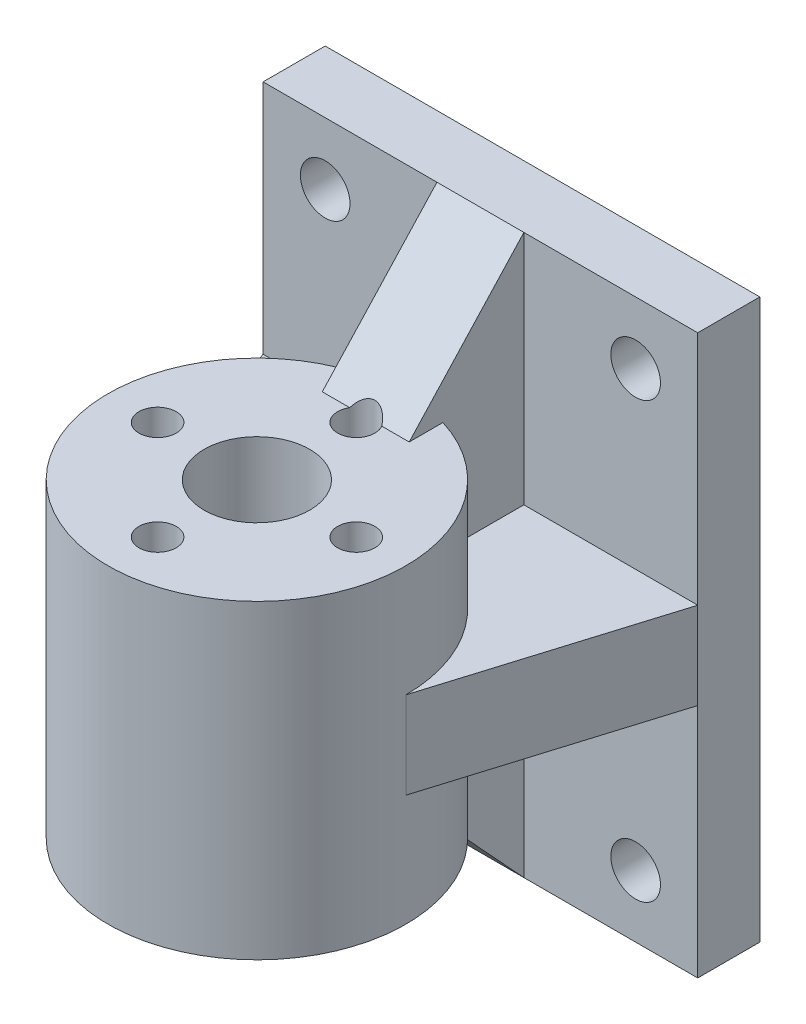
ISO-10303-21;
HEADER;
FILE_DESCRIPTION(('STEP AP214'),'2;1');
FILE_NAME('part.step','',(''),(''),'','','');
FILE_SCHEMA(('AUTOMOTIVE_DESIGN { 1 0 10303 214 1 1 1 1 }'));
ENDSEC;
DATA;
#1=APPLICATION_CONTEXT('core data for automotive mechanical design processes');
#2=APPLICATION_PROTOCOL_DEFINITION('international standard','automotive_design',2000,#1);
#3=PRODUCT_CONTEXT('',#1,'mechanical');
#4=PRODUCT('Part','Part','',(#3));
#5=PRODUCT_RELATED_PRODUCT_CATEGORY('part','',(#4));
#6=PRODUCT_DEFINITION_FORMATION('','',#4);
#7=PRODUCT_DEFINITION_CONTEXT('part definition',#1,'design');
#8=PRODUCT_DEFINITION('design','',#6,#7);
#9=PRODUCT_DEFINITION_SHAPE('','',#8);
#10=(LENGTH_UNIT() NAMED_UNIT(*) SI_UNIT(.MILLI.,.METRE.));
#11=(NAMED_UNIT(*) PLANE_ANGLE_UNIT() SI_UNIT($,.RADIAN.));
#12=(NAMED_UNIT(*) SI_UNIT($,.STERADIAN.) SOLID_ANGLE_UNIT());
#13=UNCERTAINTY_MEASURE_WITH_UNIT(LENGTH_MEASURE(1.E-05),#10,'distance_accuracy_value','');
#14=(GEOMETRIC_REPRESENTATION_CONTEXT(3) GLOBAL_UNCERTAINTY_ASSIGNED_CONTEXT((#13)) GLOBAL_UNIT_ASSIGNED_CONTEXT((#10,
#11,#12)) REPRESENTATION_CONTEXT('',''));
#15=CARTESIAN_POINT('',(0.,0.,0.));
#16=DIRECTION('',(0.,0.,1.));
#17=DIRECTION('',(1.,0.,0.));
#18=AXIS2_PLACEMENT_3D('',#15,#16,#17);
#19=CARTESIAN_POINT('',(3.5,45.,0.));
#20=DIRECTION('',(0.,0.6784478932512,0.734648525584179));
#21=DIRECTION('',(0.,-0.734648525584179,0.6784478932512));
#22=AXIS2_PLACEMENT_3D('',#19,#20,#21);
#23=PLANE('',#22);
#24=DIRECTION('',(-1.,0.,0.));
#25=VECTOR('',#24,1.);
#26=CARTESIAN_POINT('',(3.5,35.,9.23499972604873));
#27=LINE('',#26,#25);
#28=CARTESIAN_POINT('',(-1.29026143895512,35.,9.23499972604873));
#29=VERTEX_POINT('',#28);
#30=CARTESIAN_POINT('',(-3.49999999999999,35.,9.23499972604873));
#31=VERTEX_POINT('',#30);
#32=EDGE_CURVE('E180',#29,#31,#27,.T.);
#33=ORIENTED_EDGE('',*,*,#32,.F.);
#34=CARTESIAN_POINT('',(0.,34.171629348517,10.));
#35=DIRECTION('',(0.,0.6784478932512,0.734648525584179));
#36=DIRECTION('',(0.,-0.734648525584179,0.6784478932512));
#37=AXIS2_PLACEMENT_3D('',#34,#35,#36);
#38=ELLIPSE('',#37,2.21092881991545,1.5);
#39=CARTESIAN_POINT('',(1.29026143895507,35.,9.23499972604873));
#40=VERTEX_POINT('',#39);
#41=EDGE_CURVE('E48',#29,#40,#38,.F.);
#42=ORIENTED_EDGE('',*,*,#41,.T.);
#43=CARTESIAN_POINT('',(3.5,35.,9.23499972604873));
#44=VERTEX_POINT('',#43);
#45=EDGE_CURVE('E177',#44,#40,#27,.T.);
#46=ORIENTED_EDGE('',*,*,#45,.F.);
#47=DIRECTION('',(0.,0.734648525584179,-0.6784478932512));
#48=VECTOR('',#47,1.);
#49=CARTESIAN_POINT('',(3.5,45.,0.));
#50=LINE('',#49,#48);
#51=CARTESIAN_POINT('',(3.5,45.,0.));
#52=VERTEX_POINT('',#51);
#53=EDGE_CURVE('E407',#44,#52,#50,.T.);
#54=ORIENTED_EDGE('',*,*,#53,.T.);
#55=DIRECTION('',(-1.,0.,0.));
#56=VECTOR('',#55,1.);
#57=CARTESIAN_POINT('',(3.5,45.,0.));
#58=LINE('',#57,#56);
#59=CARTESIAN_POINT('',(-3.5,45.,0.));
#60=VERTEX_POINT('',#59);
#61=EDGE_CURVE('E187',#52,#60,#58,.T.);
#62=ORIENTED_EDGE('',*,*,#61,.T.);
#63=DIRECTION('',(0.,0.734648525584179,-0.6784478932512));
#64=VECTOR('',#63,1.);
#65=CARTESIAN_POINT('',(-3.5,45.,0.));
#66=LINE('',#65,#64);
#67=EDGE_CURVE('E416',#31,#60,#66,.T.);
#68=ORIENTED_EDGE('',*,*,#67,.F.);
#69=EDGE_LOOP('',(#33,#42,#46,#54,#62,#68));
#70=FACE_BOUND('',#69,.T.);
#71=ADVANCED_FACE('F34',(#70),#23,.T.);
#72=CARTESIAN_POINT('',(17.5,45.,0.));
#73=DIRECTION('',(0.,0.,-1.));
#74=DIRECTION('',(-1.,0.,0.));
#75=AXIS2_PLACEMENT_3D('',#72,#73,#74);
#76=PLANE('',#75);
#77=CARTESIAN_POINT('',(-12.5,5.,0.));
#78=DIRECTION('',(0.,0.,-1.));
#79=DIRECTION('',(-1.,0.,0.));
#80=AXIS2_PLACEMENT_3D('',#77,#78,#79);
#81=CIRCLE('',#80,2.);
#82=CARTESIAN_POINT('',(-14.5,5.,0.));
#83=VERTEX_POINT('',#82);
#84=EDGE_CURVE('E489',#83,#83,#81,.F.);
#85=ORIENTED_EDGE('',*,*,#84,.F.);
#86=EDGE_LOOP('',(#85));
#87=FACE_BOUND('',#86,.T.);
#88=DIRECTION('',(1.,0.,0.));
#89=VECTOR('',#88,1.);
#90=CARTESIAN_POINT('',(17.5,19.,0.));
#91=LINE('',#90,#89);
#92=CARTESIAN_POINT('',(-17.5,19.,0.));
#93=VERTEX_POINT('',#92);
#94=CARTESIAN_POINT('',(-3.5,19.,0.));
#95=VERTEX_POINT('',#94);
#96=EDGE_CURVE('E365',#93,#95,#91,.T.);
#97=ORIENTED_EDGE('',*,*,#96,.F.);
#98=DIRECTION('',(0.,-1.,0.));
#99=VECTOR('',#98,1.);
#100=CARTESIAN_POINT('',(-17.5,45.,0.));
#101=LINE('',#100,#99);
#102=CARTESIAN_POINT('',(-17.5,0.,0.));
#103=VERTEX_POINT('',#102);
#104=EDGE_CURVE('E224',#93,#103,#101,.T.);
#105=ORIENTED_EDGE('',*,*,#104,.T.);
#106=DIRECTION('',(1.,0.,0.));
#107=VECTOR('',#106,1.);
#108=CARTESIAN_POINT('',(17.5,0.,0.));
#109=LINE('',#108,#107);
#110=CARTESIAN_POINT('',(-3.5,0.,0.));
#111=VERTEX_POINT('',#110);
#112=EDGE_CURVE('E201',#103,#111,#109,.T.);
#113=ORIENTED_EDGE('',*,*,#112,.T.);
#114=DIRECTION('',(0.,-1.,0.));
#115=VECTOR('',#114,1.);
#116=CARTESIAN_POINT('',(-3.5,0.,0.));
#117=LINE('',#116,#115);
#118=EDGE_CURVE('E419',#95,#111,#117,.T.);
#119=ORIENTED_EDGE('',*,*,#118,.F.);
#120=EDGE_LOOP('',(#97,#105,#113,#119));
#121=FACE_BOUND('',#120,.T.);
#122=ADVANCED_FACE('F277',(#87,#121),#76,.F.);
#123=CARTESIAN_POINT('',(12.5,5.,0.));
#124=DIRECTION('',(0.,0.,-1.));
#125=DIRECTION('',(-1.,0.,0.));
#126=AXIS2_PLACEMENT_3D('',#123,#124,#125);
#127=CIRCLE('',#126,2.);
#128=CARTESIAN_POINT('',(10.5,5.,0.));
#129=VERTEX_POINT('',#128);
#130=EDGE_CURVE('E482',#129,#129,#127,.F.);
#131=ORIENTED_EDGE('',*,*,#130,.F.);
#132=EDGE_LOOP('',(#131));
#133=FACE_BOUND('',#132,.T.);
#134=CARTESIAN_POINT('',(3.5,19.,0.));
#135=VERTEX_POINT('',#134);
#136=CARTESIAN_POINT('',(17.5,19.,0.));
#137=VERTEX_POINT('',#136);
#138=EDGE_CURVE('E368',#135,#137,#91,.T.);
#139=ORIENTED_EDGE('',*,*,#138,.F.);
#140=DIRECTION('',(0.,-1.,0.));
#141=VECTOR('',#140,1.);
#142=CARTESIAN_POINT('',(3.5,0.,0.));
#143=LINE('',#142,#141);
#144=CARTESIAN_POINT('',(3.5,0.,0.));
#145=VERTEX_POINT('',#144);
#146=EDGE_CURVE('E410',#135,#145,#143,.T.);
#147=ORIENTED_EDGE('',*,*,#146,.T.);
#148=CARTESIAN_POINT('',(17.5,0.,0.));
#149=VERTEX_POINT('',#148);
#150=EDGE_CURVE('E218',#145,#149,#109,.T.);
#151=ORIENTED_EDGE('',*,*,#150,.T.);
#152=DIRECTION('',(0.,-1.,0.));
#153=VECTOR('',#152,1.);
#154=CARTESIAN_POINT('',(17.5,45.,0.));
#155=LINE('',#154,#153);
#156=EDGE_CURVE('E209',#137,#149,#155,.T.);
#157=ORIENTED_EDGE('',*,*,#156,.F.);
#158=EDGE_LOOP('',(#139,#147,#151,#157));
#159=FACE_BOUND('',#158,.T.);
#160=ADVANCED_FACE('F282',(#133,#159),#76,.F.);
#161=CARTESIAN_POINT('',(3.50000000000001,0.,0.));
#162=DIRECTION('',(-1.,0.,0.));
#163=DIRECTION('',(0.,0.,1.));
#164=AXIS2_PLACEMENT_3D('',#161,#162,#163);
#165=PLANE('',#164);
#166=DIRECTION('',(0.,0.,-1.));
#167=VECTOR('',#166,1.);
#168=CARTESIAN_POINT('',(3.50000000000001,19.,0.));
#169=LINE('',#168,#167);
#170=CARTESIAN_POINT('',(3.5,19.,6.52175971675101));
#171=VERTEX_POINT('',#170);
#172=EDGE_CURVE('E381',#171,#135,#169,.T.);
#173=ORIENTED_EDGE('',*,*,#172,.F.);
#174=DIRECTION('',(0.,-1.,0.));
#175=VECTOR('',#174,1.);
#176=CARTESIAN_POINT('',(3.5,35.,6.52175971675101));
#177=LINE('',#176,#175);
#178=CARTESIAN_POINT('',(3.5,10.,6.52175971675101));
#179=VERTEX_POINT('',#178);
#180=EDGE_CURVE('E398',#179,#171,#177,.F.);
#181=ORIENTED_EDGE('',*,*,#180,.F.);
#182=DIRECTION('',(0.,0.,-1.));
#183=VECTOR('',#182,1.);
#184=CARTESIAN_POINT('',(3.50000000000001,10.,0.));
#185=LINE('',#184,#183);
#186=CARTESIAN_POINT('',(3.5,10.,9.23499972604873));
#187=VERTEX_POINT('',#186);
#188=EDGE_CURVE('E400',#187,#179,#185,.T.);
#189=ORIENTED_EDGE('',*,*,#188,.F.);
#190=DIRECTION('',(0.,0.734648525584179,0.6784478932512));
#191=VECTOR('',#190,1.);
#192=CARTESIAN_POINT('',(3.5,10.,9.23499972604873));
#193=LINE('',#192,#191);
#194=EDGE_CURVE('E404',#145,#187,#193,.T.);
#195=ORIENTED_EDGE('',*,*,#194,.F.);
#196=ORIENTED_EDGE('',*,*,#146,.F.);
#197=EDGE_LOOP('',(#173,#181,#189,#195,#196));
#198=FACE_BOUND('',#197,.T.);
#199=ADVANCED_FACE('F457',(#198),#165,.F.);
#200=CARTESIAN_POINT('',(-3.49999999999999,0.,0.));
#201=DIRECTION('',(-1.,0.,0.));
#202=DIRECTION('',(0.,0.,1.));
#203=AXIS2_PLACEMENT_3D('',#200,#201,#202);
#204=PLANE('',#203);
#205=DIRECTION('',(0.,-1.,0.));
#206=VECTOR('',#205,1.);
#207=CARTESIAN_POINT('',(-3.49999999999999,35.,6.521759716751));
#208=LINE('',#207,#206);
#209=CARTESIAN_POINT('',(-3.49999999999999,10.,6.521759716751));
#210=VERTEX_POINT('',#209);
#211=CARTESIAN_POINT('',(-3.49999999999999,19.,6.521759716751));
#212=VERTEX_POINT('',#211);
#213=EDGE_CURVE('E235',#210,#212,#208,.F.);
#214=ORIENTED_EDGE('',*,*,#213,.T.);
#215=DIRECTION('',(0.,0.,-1.));
#216=VECTOR('',#215,1.);
#217=CARTESIAN_POINT('',(-3.49999999999999,19.,0.));
#218=LINE('',#217,#216);
#219=EDGE_CURVE('E376',#212,#95,#218,.T.);
#220=ORIENTED_EDGE('',*,*,#219,.T.);
#221=ORIENTED_EDGE('',*,*,#118,.T.);
#222=DIRECTION('',(0.,0.734648525584179,0.6784478932512));
#223=VECTOR('',#222,1.);
#224=CARTESIAN_POINT('',(-3.5,10.,9.23499972604873));
#225=LINE('',#224,#223);
#226=CARTESIAN_POINT('',(-3.49999999999999,10.,9.23499972604873));
#227=VERTEX_POINT('',#226);
#228=EDGE_CURVE('E403',#111,#227,#225,.T.);
#229=ORIENTED_EDGE('',*,*,#228,.T.);
#230=DIRECTION('',(0.,0.,-1.));
#231=VECTOR('',#230,1.);
#232=CARTESIAN_POINT('',(-3.49999999999999,10.,0.));
#233=LINE('',#232,#231);
#234=EDGE_CURVE('E238',#227,#210,#233,.T.);
#235=ORIENTED_EDGE('',*,*,#234,.T.);
#236=EDGE_LOOP('',(#214,#220,#221,#229,#235));
#237=FACE_BOUND('',#236,.T.);
#238=ADVANCED_FACE('F319',(#237),#204,.T.);
#239=CARTESIAN_POINT('',(-12.5,40.,0.));
#240=DIRECTION('',(0.,0.,-1.));
#241=DIRECTION('',(-1.,0.,0.));
#242=AXIS2_PLACEMENT_3D('',#239,#240,#241);
#243=CIRCLE('',#242,2.);
#244=CARTESIAN_POINT('',(-14.5,40.,0.));
#245=VERTEX_POINT('',#244);
#246=EDGE_CURVE('E483',#245,#245,#243,.F.);
#247=ORIENTED_EDGE('',*,*,#246,.F.);
#248=EDGE_LOOP('',(#247));
#249=FACE_BOUND('',#248,.T.);
#250=CARTESIAN_POINT('',(-17.5,45.,0.));
#251=VERTEX_POINT('',#250);
#252=CARTESIAN_POINT('',(-17.5,26.,0.));
#253=VERTEX_POINT('',#252);
#254=EDGE_CURVE('E225',#251,#253,#101,.T.);
#255=ORIENTED_EDGE('',*,*,#254,.T.);
#256=DIRECTION('',(1.,0.,0.));
#257=VECTOR('',#256,1.);
#258=CARTESIAN_POINT('',(17.5,26.,0.));
#259=LINE('',#258,#257);
#260=CARTESIAN_POINT('',(-3.5,26.,0.));
#261=VERTEX_POINT('',#260);
#262=EDGE_CURVE('E358',#253,#261,#259,.T.);
#263=ORIENTED_EDGE('',*,*,#262,.T.);
#264=EDGE_CURVE('E408',#60,#261,#117,.T.);
#265=ORIENTED_EDGE('',*,*,#264,.F.);
#266=DIRECTION('',(1.,0.,0.));
#267=VECTOR('',#266,1.);
#268=CARTESIAN_POINT('',(17.5,45.,0.));
#269=LINE('',#268,#267);
#270=EDGE_CURVE('E206',#251,#60,#269,.T.);
#271=ORIENTED_EDGE('',*,*,#270,.F.);
#272=EDGE_LOOP('',(#255,#263,#265,#271));
#273=FACE_BOUND('',#272,.T.);
#274=ADVANCED_FACE('F306',(#249,#273),#76,.F.);
#275=CARTESIAN_POINT('',(17.5,45.,0.));
#276=DIRECTION('',(-1.,0.,0.));
#277=DIRECTION('',(0.,0.,1.));
#278=AXIS2_PLACEMENT_3D('',#275,#276,#277);
#279=PLANE('',#278);
#280=DIRECTION('',(0.,0.,-1.));
#281=VECTOR('',#280,1.);
#282=CARTESIAN_POINT('',(17.5,0.,0.));
#283=LINE('',#282,#281);
#284=CARTESIAN_POINT('',(17.5,0.,-5.));
#285=VERTEX_POINT('',#284);
#286=EDGE_CURVE('E210',#149,#285,#283,.T.);
#287=ORIENTED_EDGE('',*,*,#286,.T.);
#288=DIRECTION('',(0.,-1.,0.));
#289=VECTOR('',#288,1.);
#290=CARTESIAN_POINT('',(17.5,45.,-5.));
#291=LINE('',#290,#289);
#292=CARTESIAN_POINT('',(17.5,45.,-5.));
#293=VERTEX_POINT('',#292);
#294=EDGE_CURVE('E231',#293,#285,#291,.T.);
#295=ORIENTED_EDGE('',*,*,#294,.F.);
#296=DIRECTION('',(0.,0.,-1.));
#297=VECTOR('',#296,1.);
#298=CARTESIAN_POINT('',(17.5,45.,0.));
#299=LINE('',#298,#297);
#300=CARTESIAN_POINT('',(17.5,45.,0.));
#301=VERTEX_POINT('',#300);
#302=EDGE_CURVE('E197',#301,#293,#299,.T.);
#303=ORIENTED_EDGE('',*,*,#302,.F.);
#304=CARTESIAN_POINT('',(17.5,26.,0.));
#305=VERTEX_POINT('',#304);
#306=EDGE_CURVE('E221',#301,#305,#155,.T.);
#307=ORIENTED_EDGE('',*,*,#306,.T.);
#308=DIRECTION('',(0.,-1.,0.));
#309=VECTOR('',#308,1.);
#310=CARTESIAN_POINT('',(17.5,26.,0.));
#311=LINE('',#310,#309);
#312=EDGE_CURVE('E337',#305,#137,#311,.T.);
#313=ORIENTED_EDGE('',*,*,#312,.T.);
#314=ORIENTED_EDGE('',*,*,#156,.T.);
#315=EDGE_LOOP('',(#287,#295,#303,#307,#313,#314));
#316=FACE_BOUND('',#315,.T.);
#317=ADVANCED_FACE('F312',(#316),#279,.F.);
#318=CARTESIAN_POINT('',(17.5,45.,-5.));
#319=DIRECTION('',(0.,0.,1.));
#320=DIRECTION('',(1.,0.,0.));
#321=AXIS2_PLACEMENT_3D('',#318,#319,#320);
#322=PLANE('',#321);
#323=CARTESIAN_POINT('',(12.5,40.,-5.));
#324=DIRECTION('',(0.,0.,-1.));
#325=DIRECTION('',(-1.,0.,0.));
#326=AXIS2_PLACEMENT_3D('',#323,#324,#325);
#327=CIRCLE('',#326,2.);
#328=CARTESIAN_POINT('',(10.5,40.,-5.));
#329=VERTEX_POINT('',#328);
#330=EDGE_CURVE('E254',#329,#329,#327,.T.);
#331=ORIENTED_EDGE('',*,*,#330,.F.);
#332=EDGE_LOOP('',(#331));
#333=FACE_BOUND('',#332,.T.);
#334=CARTESIAN_POINT('',(12.5,5.,-5.));
#335=DIRECTION('',(0.,0.,-1.));
#336=DIRECTION('',(-1.,0.,0.));
#337=AXIS2_PLACEMENT_3D('',#334,#335,#336);
#338=CIRCLE('',#337,2.);
#339=CARTESIAN_POINT('',(10.5,5.,-5.));
#340=VERTEX_POINT('',#339);
#341=EDGE_CURVE('E495',#340,#340,#338,.T.);
#342=ORIENTED_EDGE('',*,*,#341,.F.);
#343=EDGE_LOOP('',(#342));
#344=FACE_BOUND('',#343,.T.);
#345=CARTESIAN_POINT('',(-12.5,5.,-5.));
#346=DIRECTION('',(0.,0.,-1.));
#347=DIRECTION('',(-1.,0.,0.));
#348=AXIS2_PLACEMENT_3D('',#345,#346,#347);
#349=CIRCLE('',#348,2.);
#350=CARTESIAN_POINT('',(-14.5,5.,-5.));
#351=VERTEX_POINT('',#350);
#352=EDGE_CURVE('E499',#351,#351,#349,.T.);
#353=ORIENTED_EDGE('',*,*,#352,.F.);
#354=EDGE_LOOP('',(#353));
#355=FACE_BOUND('',#354,.T.);
#356=CARTESIAN_POINT('',(-12.5,40.,-5.));
#357=DIRECTION('',(0.,0.,-1.));
#358=DIRECTION('',(-1.,0.,0.));
#359=AXIS2_PLACEMENT_3D('',#356,#357,#358);
#360=CIRCLE('',#359,2.);
#361=CARTESIAN_POINT('',(-14.5,40.,-5.));
#362=VERTEX_POINT('',#361);
#363=EDGE_CURVE('E485',#362,#362,#360,.T.);
#364=ORIENTED_EDGE('',*,*,#363,.F.);
#365=EDGE_LOOP('',(#364));
#366=FACE_BOUND('',#365,.T.);
#367=DIRECTION('',(-1.,0.,0.));
#368=VECTOR('',#367,1.);
#369=CARTESIAN_POINT('',(17.5,0.,-5.));
#370=LINE('',#369,#368);
#371=CARTESIAN_POINT('',(-17.5,0.,-5.));
#372=VERTEX_POINT('',#371);
#373=EDGE_CURVE('E213',#285,#372,#370,.T.);
#374=ORIENTED_EDGE('',*,*,#373,.T.);
#375=DIRECTION('',(0.,-1.,0.));
#376=VECTOR('',#375,1.);
#377=CARTESIAN_POINT('',(-17.5,45.,-5.));
#378=LINE('',#377,#376);
#379=CARTESIAN_POINT('',(-17.5,45.,-5.));
#380=VERTEX_POINT('',#379);
#381=EDGE_CURVE('E228',#380,#372,#378,.T.);
#382=ORIENTED_EDGE('',*,*,#381,.F.);
#383=DIRECTION('',(-1.,0.,0.));
#384=VECTOR('',#383,1.);
#385=CARTESIAN_POINT('',(17.5,45.,-5.));
#386=LINE('',#385,#384);
#387=EDGE_CURVE('E200',#293,#380,#386,.T.);
#388=ORIENTED_EDGE('',*,*,#387,.F.);
#389=ORIENTED_EDGE('',*,*,#294,.T.);
#390=EDGE_LOOP('',(#374,#382,#388,#389));
#391=FACE_BOUND('',#390,.T.);
#392=ADVANCED_FACE('F309',(#333,#344,#355,#366,#391),#322,.F.);
#393=CARTESIAN_POINT('',(-17.5,45.,0.));
#394=DIRECTION('',(1.,0.,0.));
#395=DIRECTION('',(0.,0.,-1.));
#396=AXIS2_PLACEMENT_3D('',#393,#394,#395);
#397=PLANE('',#396);
#398=DIRECTION('',(0.,0.,1.));
#399=VECTOR('',#398,1.);
#400=CARTESIAN_POINT('',(-17.5,0.,0.));
#401=LINE('',#400,#399);
#402=EDGE_CURVE('E215',#372,#103,#401,.T.);
#403=ORIENTED_EDGE('',*,*,#402,.T.);
#404=ORIENTED_EDGE('',*,*,#104,.F.);
#405=DIRECTION('',(0.,-1.,0.));
#406=VECTOR('',#405,1.);
#407=CARTESIAN_POINT('',(-17.5,26.,0.));
#408=LINE('',#407,#406);
#409=EDGE_CURVE('E373',#253,#93,#408,.T.);
#410=ORIENTED_EDGE('',*,*,#409,.F.);
#411=ORIENTED_EDGE('',*,*,#254,.F.);
#412=DIRECTION('',(0.,0.,1.));
#413=VECTOR('',#412,1.);
#414=CARTESIAN_POINT('',(-17.5,45.,0.));
#415=LINE('',#414,#413);
#416=EDGE_CURVE('E203',#380,#251,#415,.T.);
#417=ORIENTED_EDGE('',*,*,#416,.F.);
#418=ORIENTED_EDGE('',*,*,#381,.T.);
#419=EDGE_LOOP('',(#403,#404,#410,#411,#417,#418));
#420=FACE_BOUND('',#419,.T.);
#421=ADVANCED_FACE('F304',(#420),#397,.F.);
#422=CARTESIAN_POINT('',(12.5,40.,0.));
#423=DIRECTION('',(0.,0.,-1.));
#424=DIRECTION('',(-1.,0.,0.));
#425=AXIS2_PLACEMENT_3D('',#422,#423,#424);
#426=CIRCLE('',#425,2.);
#427=CARTESIAN_POINT('',(10.5,40.,0.));
#428=VERTEX_POINT('',#427);
#429=EDGE_CURVE('E492',#428,#428,#426,.F.);
#430=ORIENTED_EDGE('',*,*,#429,.F.);
#431=EDGE_LOOP('',(#430));
#432=FACE_BOUND('',#431,.T.);
#433=CARTESIAN_POINT('',(3.5,26.,0.));
#434=VERTEX_POINT('',#433);
#435=EDGE_CURVE('E411',#52,#434,#143,.T.);
#436=ORIENTED_EDGE('',*,*,#435,.T.);
#437=EDGE_CURVE('E357',#434,#305,#259,.T.);
#438=ORIENTED_EDGE('',*,*,#437,.T.);
#439=ORIENTED_EDGE('',*,*,#306,.F.);
#440=EDGE_CURVE('E205',#52,#301,#269,.T.);
#441=ORIENTED_EDGE('',*,*,#440,.F.);
#442=EDGE_LOOP('',(#436,#438,#439,#441));
#443=FACE_BOUND('',#442,.T.);
#444=ADVANCED_FACE('F285',(#432,#443),#76,.F.);
#445=CARTESIAN_POINT('',(0.,45.,0.));
#446=DIRECTION('',(0.,1.,0.));
#447=DIRECTION('',(0.,0.,1.));
#448=AXIS2_PLACEMENT_3D('',#445,#446,#447);
#449=PLANE('',#448);
#450=ORIENTED_EDGE('',*,*,#302,.T.);
#451=ORIENTED_EDGE('',*,*,#387,.T.);
#452=ORIENTED_EDGE('',*,*,#416,.T.);
#453=ORIENTED_EDGE('',*,*,#270,.T.);
#454=ORIENTED_EDGE('',*,*,#61,.F.);
#455=ORIENTED_EDGE('',*,*,#440,.T.);
#456=EDGE_LOOP('',(#450,#451,#452,#453,#454,#455));
#457=FACE_BOUND('',#456,.T.);
#458=ADVANCED_FACE('F296',(#457),#449,.T.);
#459=CARTESIAN_POINT('',(0.,0.,0.));
#460=DIRECTION('',(0.,1.,0.));
#461=DIRECTION('',(0.,0.,1.));
#462=AXIS2_PLACEMENT_3D('',#459,#460,#461);
#463=PLANE('',#462);
#464=ORIENTED_EDGE('',*,*,#286,.F.);
#465=ORIENTED_EDGE('',*,*,#150,.F.);
#466=DIRECTION('',(-1.,0.,0.));
#467=VECTOR('',#466,1.);
#468=CARTESIAN_POINT('',(3.5,0.,0.));
#469=LINE('',#468,#467);
#470=EDGE_CURVE('E189',#145,#111,#469,.T.);
#471=ORIENTED_EDGE('',*,*,#470,.T.);
#472=ORIENTED_EDGE('',*,*,#112,.F.);
#473=ORIENTED_EDGE('',*,*,#402,.F.);
#474=ORIENTED_EDGE('',*,*,#373,.F.);
#475=EDGE_LOOP('',(#464,#465,#471,#472,#473,#474));
#476=FACE_BOUND('',#475,.T.);
#477=ADVANCED_FACE('F294',(#476),#463,.F.);
#478=CARTESIAN_POINT('',(3.5,10.,9.23499972604873));
#479=DIRECTION('',(0.,-0.6784478932512,0.734648525584179));
#480=DIRECTION('',(0.,-0.734648525584179,-0.6784478932512));
#481=AXIS2_PLACEMENT_3D('',#478,#479,#480);
#482=PLANE('',#481);
#483=DIRECTION('',(-1.,0.,0.));
#484=VECTOR('',#483,1.);
#485=CARTESIAN_POINT('',(3.5,10.,9.23499972604873));
#486=LINE('',#485,#484);
#487=CARTESIAN_POINT('',(1.29026143895507,10.,9.23499972604873));
#488=VERTEX_POINT('',#487);
#489=EDGE_CURVE('E191',#187,#488,#486,.T.);
#490=ORIENTED_EDGE('',*,*,#489,.T.);
#491=CARTESIAN_POINT('',(0.,10.828370651483,10.));
#492=DIRECTION('',(0.,-0.6784478932512,0.734648525584179));
#493=DIRECTION('',(0.,0.734648525584179,0.6784478932512));
#494=AXIS2_PLACEMENT_3D('',#491,#492,#493);
#495=ELLIPSE('',#494,2.21092881991545,1.5);
#496=CARTESIAN_POINT('',(-1.29026143895512,10.,9.23499972604873));
#497=VERTEX_POINT('',#496);
#498=EDGE_CURVE('E55',#488,#497,#495,.F.);
#499=ORIENTED_EDGE('',*,*,#498,.T.);
#500=EDGE_CURVE('E196',#497,#227,#486,.T.);
#501=ORIENTED_EDGE('',*,*,#500,.T.);
#502=ORIENTED_EDGE('',*,*,#228,.F.);
#503=ORIENTED_EDGE('',*,*,#470,.F.);
#504=ORIENTED_EDGE('',*,*,#194,.T.);
#505=EDGE_LOOP('',(#490,#499,#501,#502,#503,#504));
#506=FACE_BOUND('',#505,.T.);
#507=ADVANCED_FACE('F290',(#506),#482,.T.);
#508=CARTESIAN_POINT('',(3.5,26.,6.52175971675101));
#509=VERTEX_POINT('',#508);
#510=CARTESIAN_POINT('',(3.5,35.,6.52175971675101));
#511=VERTEX_POINT('',#510);
#512=EDGE_CURVE('E395',#509,#511,#177,.F.);
#513=ORIENTED_EDGE('',*,*,#512,.F.);
#514=DIRECTION('',(0.,0.,-1.));
#515=VECTOR('',#514,1.);
#516=CARTESIAN_POINT('',(3.50000000000001,26.,0.));
#517=LINE('',#516,#515);
#518=EDGE_CURVE('E387',#509,#434,#517,.T.);
#519=ORIENTED_EDGE('',*,*,#518,.T.);
#520=ORIENTED_EDGE('',*,*,#435,.F.);
#521=ORIENTED_EDGE('',*,*,#53,.F.);
#522=DIRECTION('',(0.,0.,-1.));
#523=VECTOR('',#522,1.);
#524=CARTESIAN_POINT('',(3.50000000000001,35.,0.));
#525=LINE('',#524,#523);
#526=EDGE_CURVE('E186',#44,#511,#525,.T.);
#527=ORIENTED_EDGE('',*,*,#526,.T.);
#528=EDGE_LOOP('',(#513,#519,#520,#521,#527));
#529=FACE_BOUND('',#528,.T.);
#530=ADVANCED_FACE('F293',(#529),#165,.F.);
#531=DIRECTION('',(0.,0.,-1.));
#532=VECTOR('',#531,1.);
#533=CARTESIAN_POINT('',(-3.49999999999999,26.,0.));
#534=LINE('',#533,#532);
#535=CARTESIAN_POINT('',(-3.49999999999999,26.,6.521759716751));
#536=VERTEX_POINT('',#535);
#537=EDGE_CURVE('E384',#536,#261,#534,.T.);
#538=ORIENTED_EDGE('',*,*,#537,.F.);
#539=CARTESIAN_POINT('',(-3.49999999999999,35.,6.521759716751));
#540=VERTEX_POINT('',#539);
#541=EDGE_CURVE('E234',#536,#540,#208,.F.);
#542=ORIENTED_EDGE('',*,*,#541,.T.);
#543=DIRECTION('',(0.,0.,-1.));
#544=VECTOR('',#543,1.);
#545=CARTESIAN_POINT('',(-3.49999999999999,35.,0.));
#546=LINE('',#545,#544);
#547=EDGE_CURVE('E241',#31,#540,#546,.T.);
#548=ORIENTED_EDGE('',*,*,#547,.F.);
#549=ORIENTED_EDGE('',*,*,#67,.T.);
#550=ORIENTED_EDGE('',*,*,#264,.T.);
#551=EDGE_LOOP('',(#538,#542,#548,#549,#550));
#552=FACE_BOUND('',#551,.T.);
#553=ADVANCED_FACE('F288',(#552),#204,.T.);
#554=CARTESIAN_POINT('',(0.,35.,18.));
#555=DIRECTION('',(0.,1.,0.));
#556=DIRECTION('',(0.,0.,1.));
#557=AXIS2_PLACEMENT_3D('',#554,#555,#556);
#558=PLANE('',#557);
#559=CARTESIAN_POINT('',(-8.,35.,18.));
#560=DIRECTION('',(0.,1.,0.));
#561=DIRECTION('',(0.,0.,1.));
#562=AXIS2_PLACEMENT_3D('',#559,#560,#561);
#563=CIRCLE('',#562,1.5);
#564=CARTESIAN_POINT('',(-8.,35.,19.5));
#565=VERTEX_POINT('',#564);
#566=EDGE_CURVE('E173',#565,#565,#563,.F.);
#567=ORIENTED_EDGE('',*,*,#566,.T.);
#568=EDGE_LOOP('',(#567));
#569=FACE_BOUND('',#568,.T.);
#570=CARTESIAN_POINT('',(0.,35.,26.));
#571=DIRECTION('',(0.,1.,0.));
#572=DIRECTION('',(0.,0.,1.));
#573=AXIS2_PLACEMENT_3D('',#570,#571,#572);
#574=CIRCLE('',#573,1.5);
#575=CARTESIAN_POINT('',(0.,35.,27.5));
#576=VERTEX_POINT('',#575);
#577=EDGE_CURVE('E509',#576,#576,#574,.F.);
#578=ORIENTED_EDGE('',*,*,#577,.T.);
#579=EDGE_LOOP('',(#578));
#580=FACE_BOUND('',#579,.T.);
#581=CARTESIAN_POINT('',(8.,35.,18.));
#582=DIRECTION('',(0.,1.,0.));
#583=DIRECTION('',(0.,0.,1.));
#584=AXIS2_PLACEMENT_3D('',#581,#582,#583);
#585=CIRCLE('',#584,1.5);
#586=CARTESIAN_POINT('',(8.,35.,19.5));
#587=VERTEX_POINT('',#586);
#588=EDGE_CURVE('E255',#587,#587,#585,.F.);
#589=ORIENTED_EDGE('',*,*,#588,.T.);
#590=EDGE_LOOP('',(#589));
#591=FACE_BOUND('',#590,.T.);
#592=CARTESIAN_POINT('',(0.,35.,18.));
#593=DIRECTION('',(0.,1.,0.));
#594=DIRECTION('',(0.,0.,1.));
#595=AXIS2_PLACEMENT_3D('',#592,#593,#594);
#596=CIRCLE('',#595,4.25);
#597=CARTESIAN_POINT('',(0.,35.,22.25));
#598=VERTEX_POINT('',#597);
#599=EDGE_CURVE('E389',#598,#598,#596,.T.);
#600=ORIENTED_EDGE('',*,*,#599,.F.);
#601=EDGE_LOOP('',(#600));
#602=FACE_BOUND('',#601,.T.);
#603=ORIENTED_EDGE('',*,*,#45,.T.);
#604=CARTESIAN_POINT('',(0.,35.,10.));
#605=DIRECTION('',(0.,1.,0.));
#606=DIRECTION('',(0.,0.,1.));
#607=AXIS2_PLACEMENT_3D('',#604,#605,#606);
#608=CIRCLE('',#607,1.5);
#609=EDGE_CURVE('E168',#40,#29,#608,.F.);
#610=ORIENTED_EDGE('',*,*,#609,.T.);
#611=ORIENTED_EDGE('',*,*,#32,.T.);
#612=ORIENTED_EDGE('',*,*,#547,.T.);
#613=CARTESIAN_POINT('',(0.,35.,18.));
#614=DIRECTION('',(0.,1.,0.));
#615=DIRECTION('',(0.,0.,1.));
#616=AXIS2_PLACEMENT_3D('',#613,#614,#615);
#617=CIRCLE('',#616,12.);
#618=EDGE_CURVE('E393',#540,#511,#617,.T.);
#619=ORIENTED_EDGE('',*,*,#618,.T.);
#620=ORIENTED_EDGE('',*,*,#526,.F.);
#621=EDGE_LOOP('',(#603,#610,#611,#612,#619,#620));
#622=FACE_BOUND('',#621,.T.);
#623=ADVANCED_FACE('F183',(#569,#580,#591,#602,#622),#558,.T.);
#624=CARTESIAN_POINT('',(0.,10.,18.));
#625=DIRECTION('',(0.,1.,0.));
#626=DIRECTION('',(0.,0.,1.));
#627=AXIS2_PLACEMENT_3D('',#624,#625,#626);
#628=PLANE('',#627);
#629=CARTESIAN_POINT('',(0.,10.,18.));
#630=DIRECTION('',(0.,1.,0.));
#631=DIRECTION('',(0.,0.,1.));
#632=AXIS2_PLACEMENT_3D('',#629,#630,#631);
#633=CIRCLE('',#632,4.87486935190933);
#634=CARTESIAN_POINT('',(0.,10.,22.8748693519093));
#635=VERTEX_POINT('',#634);
#636=EDGE_CURVE('E42',#635,#635,#633,.T.);
#637=ORIENTED_EDGE('',*,*,#636,.T.);
#638=EDGE_LOOP('',(#637));
#639=FACE_BOUND('',#638,.T.);
#640=CARTESIAN_POINT('',(0.,10.,10.));
#641=DIRECTION('',(0.,1.,0.));
#642=DIRECTION('',(0.,0.,1.));
#643=AXIS2_PLACEMENT_3D('',#640,#641,#642);
#644=CIRCLE('',#643,1.5);
#645=EDGE_CURVE('E261',#488,#497,#644,.F.);
#646=ORIENTED_EDGE('',*,*,#645,.F.);
#647=ORIENTED_EDGE('',*,*,#489,.F.);
#648=ORIENTED_EDGE('',*,*,#188,.T.);
#649=CARTESIAN_POINT('',(0.,10.,18.));
#650=DIRECTION('',(0.,1.,0.));
#651=DIRECTION('',(0.,0.,1.));
#652=AXIS2_PLACEMENT_3D('',#649,#650,#651);
#653=CIRCLE('',#652,12.);
#654=EDGE_CURVE('E392',#210,#179,#653,.T.);
#655=ORIENTED_EDGE('',*,*,#654,.F.);
#656=ORIENTED_EDGE('',*,*,#234,.F.);
#657=ORIENTED_EDGE('',*,*,#500,.F.);
#658=EDGE_LOOP('',(#646,#647,#648,#655,#656,#657));
#659=FACE_BOUND('',#658,.T.);
#660=CARTESIAN_POINT('',(-8.,10.,18.));
#661=DIRECTION('',(0.,1.,0.));
#662=DIRECTION('',(0.,0.,1.));
#663=AXIS2_PLACEMENT_3D('',#660,#661,#662);
#664=CIRCLE('',#663,1.5);
#665=CARTESIAN_POINT('',(-8.,10.,19.5));
#666=VERTEX_POINT('',#665);
#667=EDGE_CURVE('E258',#666,#666,#664,.F.);
#668=ORIENTED_EDGE('',*,*,#667,.F.);
#669=EDGE_LOOP('',(#668));
#670=FACE_BOUND('',#669,.T.);
#671=CARTESIAN_POINT('',(0.,10.,26.));
#672=DIRECTION('',(0.,1.,0.));
#673=DIRECTION('',(0.,0.,1.));
#674=AXIS2_PLACEMENT_3D('',#671,#672,#673);
#675=CIRCLE('',#674,1.5);
#676=CARTESIAN_POINT('',(0.,10.,27.5));
#677=VERTEX_POINT('',#676);
#678=EDGE_CURVE('E181',#677,#677,#675,.F.);
#679=ORIENTED_EDGE('',*,*,#678,.F.);
#680=EDGE_LOOP('',(#679));
#681=FACE_BOUND('',#680,.T.);
#682=CARTESIAN_POINT('',(8.,10.,18.));
#683=DIRECTION('',(0.,1.,0.));
#684=DIRECTION('',(0.,0.,1.));
#685=AXIS2_PLACEMENT_3D('',#682,#683,#684);
#686=CIRCLE('',#685,1.5);
#687=CARTESIAN_POINT('',(8.,10.,19.5));
#688=VERTEX_POINT('',#687);
#689=EDGE_CURVE('E251',#688,#688,#686,.F.);
#690=ORIENTED_EDGE('',*,*,#689,.F.);
#691=EDGE_LOOP('',(#690));
#692=FACE_BOUND('',#691,.T.);
#693=ADVANCED_FACE('F265',(#639,#659,#670,#681,#692),#628,.F.);
#694=CARTESIAN_POINT('',(0.,35.,18.));
#695=DIRECTION('',(0.,-1.,0.));
#696=DIRECTION('',(0.,0.,-1.));
#697=AXIS2_PLACEMENT_3D('',#694,#695,#696);
#698=CYLINDRICAL_SURFACE('',#697,12.);
#699=DIRECTION('',(0.,-1.,0.));
#700=VECTOR('',#699,1.);
#701=CARTESIAN_POINT('',(12.,26.,18.));
#702=LINE('',#701,#700);
#703=CARTESIAN_POINT('',(12.,26.,18.));
#704=VERTEX_POINT('',#703);
#705=CARTESIAN_POINT('',(12.,19.,18.));
#706=VERTEX_POINT('',#705);
#707=EDGE_CURVE('E349',#704,#706,#702,.T.);
#708=ORIENTED_EDGE('',*,*,#707,.F.);
#709=CARTESIAN_POINT('',(0.,26.,18.));
#710=DIRECTION('',(0.,1.,0.));
#711=DIRECTION('',(0.,0.,1.));
#712=AXIS2_PLACEMENT_3D('',#709,#710,#711);
#713=CIRCLE('',#712,12.);
#714=EDGE_CURVE('E250',#704,#509,#713,.T.);
#715=ORIENTED_EDGE('',*,*,#714,.T.);
#716=ORIENTED_EDGE('',*,*,#512,.T.);
#717=ORIENTED_EDGE('',*,*,#618,.F.);
#718=ORIENTED_EDGE('',*,*,#541,.F.);
#719=CARTESIAN_POINT('',(-12.,26.,17.9999999999999));
#720=VERTEX_POINT('',#719);
#721=EDGE_CURVE('E248',#536,#720,#713,.T.);
#722=ORIENTED_EDGE('',*,*,#721,.T.);
#723=DIRECTION('',(0.,-1.,0.));
#724=VECTOR('',#723,1.);
#725=CARTESIAN_POINT('',(-12.,26.,17.9999999999999));
#726=LINE('',#725,#724);
#727=CARTESIAN_POINT('',(-12.,19.,17.9999999999999));
#728=VERTEX_POINT('',#727);
#729=EDGE_CURVE('E377',#720,#728,#726,.T.);
#730=ORIENTED_EDGE('',*,*,#729,.T.);
#731=CARTESIAN_POINT('',(0.,19.,18.));
#732=DIRECTION('',(0.,1.,0.));
#733=DIRECTION('',(0.,0.,1.));
#734=AXIS2_PLACEMENT_3D('',#731,#732,#733);
#735=CIRCLE('',#734,12.);
#736=EDGE_CURVE('E244',#212,#728,#735,.T.);
#737=ORIENTED_EDGE('',*,*,#736,.F.);
#738=ORIENTED_EDGE('',*,*,#213,.F.);
#739=ORIENTED_EDGE('',*,*,#654,.T.);
#740=ORIENTED_EDGE('',*,*,#180,.T.);
#741=EDGE_CURVE('E247',#706,#171,#735,.T.);
#742=ORIENTED_EDGE('',*,*,#741,.F.);
#743=EDGE_LOOP('',(#708,#715,#716,#717,#718,#722,#730,#737,#738,#739,#740,#742));
#744=FACE_BOUND('',#743,.T.);
#745=ADVANCED_FACE('F440',(#744),#698,.T.);
#746=CARTESIAN_POINT('',(0.,35.,18.));
#747=DIRECTION('',(0.,-1.,0.));
#748=DIRECTION('',(0.,0.,-1.));
#749=AXIS2_PLACEMENT_3D('',#746,#747,#748);
#750=CYLINDRICAL_SURFACE('',#749,4.25);
#751=CARTESIAN_POINT('',(0.,11.,18.));
#752=DIRECTION('',(0.,1.,0.));
#753=DIRECTION('',(0.,0.,1.));
#754=AXIS2_PLACEMENT_3D('',#751,#752,#753);
#755=CIRCLE('',#754,4.25);
#756=CARTESIAN_POINT('',(0.,11.,22.25));
#757=VERTEX_POINT('',#756);
#758=EDGE_CURVE('E11',#757,#757,#755,.F.);
#759=ORIENTED_EDGE('',*,*,#758,.T.);
#760=EDGE_LOOP('',(#759));
#761=FACE_BOUND('',#760,.T.);
#762=ORIENTED_EDGE('',*,*,#599,.T.);
#763=EDGE_LOOP('',(#762));
#764=FACE_BOUND('',#763,.T.);
#765=ADVANCED_FACE('F564',(#761,#764),#750,.F.);
#766=CARTESIAN_POINT('',(0.,26.,0.));
#767=DIRECTION('',(0.,1.,0.));
#768=DIRECTION('',(0.,0.,1.));
#769=AXIS2_PLACEMENT_3D('',#766,#767,#768);
#770=PLANE('',#769);
#771=ORIENTED_EDGE('',*,*,#721,.F.);
#772=ORIENTED_EDGE('',*,*,#537,.T.);
#773=ORIENTED_EDGE('',*,*,#262,.F.);
#774=DIRECTION('',(-0.292218535599021,0.,-0.956351571051338));
#775=VECTOR('',#774,1.);
#776=CARTESIAN_POINT('',(-17.5,26.,0.));
#777=LINE('',#776,#775);
#778=EDGE_CURVE('E350',#720,#253,#777,.T.);
#779=ORIENTED_EDGE('',*,*,#778,.F.);
#780=EDGE_LOOP('',(#771,#772,#773,#779));
#781=FACE_BOUND('',#780,.T.);
#782=ADVANCED_FACE('F436',(#781),#770,.T.);
#783=CARTESIAN_POINT('',(0.,19.,0.));
#784=DIRECTION('',(0.,1.,0.));
#785=DIRECTION('',(0.,0.,1.));
#786=AXIS2_PLACEMENT_3D('',#783,#784,#785);
#787=PLANE('',#786);
#788=ORIENTED_EDGE('',*,*,#219,.F.);
#789=ORIENTED_EDGE('',*,*,#736,.T.);
#790=DIRECTION('',(-0.292218535599021,0.,-0.956351571051338));
#791=VECTOR('',#790,1.);
#792=CARTESIAN_POINT('',(-17.5,19.,0.));
#793=LINE('',#792,#791);
#794=EDGE_CURVE('E370',#728,#93,#793,.T.);
#795=ORIENTED_EDGE('',*,*,#794,.T.);
#796=ORIENTED_EDGE('',*,*,#96,.T.);
#797=EDGE_LOOP('',(#788,#789,#795,#796));
#798=FACE_BOUND('',#797,.T.);
#799=ADVANCED_FACE('F447',(#798),#787,.F.);
#800=CARTESIAN_POINT('',(-17.5,26.,0.));
#801=DIRECTION('',(-0.956351571051338,0.,0.292218535599021));
#802=DIRECTION('',(0.292218535599021,0.,0.956351571051339));
#803=AXIS2_PLACEMENT_3D('',#800,#801,#802);
#804=PLANE('',#803);
#805=ORIENTED_EDGE('',*,*,#794,.F.);
#806=ORIENTED_EDGE('',*,*,#729,.F.);
#807=ORIENTED_EDGE('',*,*,#778,.T.);
#808=ORIENTED_EDGE('',*,*,#409,.T.);
#809=EDGE_LOOP('',(#805,#806,#807,#808));
#810=FACE_BOUND('',#809,.T.);
#811=ADVANCED_FACE('F444',(#810),#804,.T.);
#812=CARTESIAN_POINT('',(12.,26.,18.));
#813=DIRECTION('',(0.956351571051339,0.,0.29221853559902));
#814=DIRECTION('',(0.29221853559902,0.,-0.956351571051339));
#815=AXIS2_PLACEMENT_3D('',#812,#813,#814);
#816=PLANE('',#815);
#817=DIRECTION('',(-0.29221853559902,0.,0.956351571051339));
#818=VECTOR('',#817,1.);
#819=CARTESIAN_POINT('',(12.,19.,18.));
#820=LINE('',#819,#818);
#821=EDGE_CURVE('E348',#137,#706,#820,.T.);
#822=ORIENTED_EDGE('',*,*,#821,.F.);
#823=ORIENTED_EDGE('',*,*,#312,.F.);
#824=DIRECTION('',(-0.29221853559902,0.,0.956351571051339));
#825=VECTOR('',#824,1.);
#826=CARTESIAN_POINT('',(12.,26.,18.));
#827=LINE('',#826,#825);
#828=EDGE_CURVE('E346',#305,#704,#827,.T.);
#829=ORIENTED_EDGE('',*,*,#828,.T.);
#830=ORIENTED_EDGE('',*,*,#707,.T.);
#831=EDGE_LOOP('',(#822,#823,#829,#830));
#832=FACE_BOUND('',#831,.T.);
#833=ADVANCED_FACE('F344',(#832),#816,.T.);
#834=ORIENTED_EDGE('',*,*,#518,.F.);
#835=ORIENTED_EDGE('',*,*,#714,.F.);
#836=ORIENTED_EDGE('',*,*,#828,.F.);
#837=ORIENTED_EDGE('',*,*,#437,.F.);
#838=EDGE_LOOP('',(#834,#835,#836,#837));
#839=FACE_BOUND('',#838,.T.);
#840=ADVANCED_FACE('F356',(#839),#770,.T.);
#841=ORIENTED_EDGE('',*,*,#741,.T.);
#842=ORIENTED_EDGE('',*,*,#172,.T.);
#843=ORIENTED_EDGE('',*,*,#138,.T.);
#844=ORIENTED_EDGE('',*,*,#821,.T.);
#845=EDGE_LOOP('',(#841,#842,#843,#844));
#846=FACE_BOUND('',#845,.T.);
#847=ADVANCED_FACE('F462',(#846),#787,.F.);
#848=CARTESIAN_POINT('',(12.5,40.,30.001));
#849=DIRECTION('',(0.,0.,-1.));
#850=DIRECTION('',(-1.,0.,0.));
#851=AXIS2_PLACEMENT_3D('',#848,#849,#850);
#852=CYLINDRICAL_SURFACE('',#851,2.);
#853=ORIENTED_EDGE('',*,*,#330,.T.);
#854=EDGE_LOOP('',(#853));
#855=FACE_BOUND('',#854,.T.);
#856=ORIENTED_EDGE('',*,*,#429,.T.);
#857=EDGE_LOOP('',(#856));
#858=FACE_BOUND('',#857,.T.);
#859=ADVANCED_FACE('F549',(#855,#858),#852,.F.);
#860=CARTESIAN_POINT('',(-12.5,40.,30.001));
#861=DIRECTION('',(0.,0.,-1.));
#862=DIRECTION('',(-1.,0.,0.));
#863=AXIS2_PLACEMENT_3D('',#860,#861,#862);
#864=CYLINDRICAL_SURFACE('',#863,2.);
#865=ORIENTED_EDGE('',*,*,#363,.T.);
#866=EDGE_LOOP('',(#865));
#867=FACE_BOUND('',#866,.T.);
#868=ORIENTED_EDGE('',*,*,#246,.T.);
#869=EDGE_LOOP('',(#868));
#870=FACE_BOUND('',#869,.T.);
#871=ADVANCED_FACE('F546',(#867,#870),#864,.F.);
#872=CARTESIAN_POINT('',(-12.5,5.,30.001));
#873=DIRECTION('',(0.,0.,-1.));
#874=DIRECTION('',(-1.,0.,0.));
#875=AXIS2_PLACEMENT_3D('',#872,#873,#874);
#876=CYLINDRICAL_SURFACE('',#875,2.);
#877=ORIENTED_EDGE('',*,*,#352,.T.);
#878=EDGE_LOOP('',(#877));
#879=FACE_BOUND('',#878,.T.);
#880=ORIENTED_EDGE('',*,*,#84,.T.);
#881=EDGE_LOOP('',(#880));
#882=FACE_BOUND('',#881,.T.);
#883=ADVANCED_FACE('F540',(#879,#882),#876,.F.);
#884=CARTESIAN_POINT('',(12.5,5.,30.001));
#885=DIRECTION('',(0.,0.,-1.));
#886=DIRECTION('',(-1.,0.,0.));
#887=AXIS2_PLACEMENT_3D('',#884,#885,#886);
#888=CYLINDRICAL_SURFACE('',#887,2.);
#889=ORIENTED_EDGE('',*,*,#341,.T.);
#890=EDGE_LOOP('',(#889));
#891=FACE_BOUND('',#890,.T.);
#892=ORIENTED_EDGE('',*,*,#130,.T.);
#893=EDGE_LOOP('',(#892));
#894=FACE_BOUND('',#893,.T.);
#895=ADVANCED_FACE('F531',(#891,#894),#888,.F.);
#896=CARTESIAN_POINT('',(8.,7.,18.));
#897=DIRECTION('',(0.,1.,0.));
#898=DIRECTION('',(0.,0.,1.));
#899=AXIS2_PLACEMENT_3D('',#896,#897,#898);
#900=CYLINDRICAL_SURFACE('',#899,1.5);
#901=ORIENTED_EDGE('',*,*,#588,.F.);
#902=EDGE_LOOP('',(#901));
#903=FACE_BOUND('',#902,.T.);
#904=ORIENTED_EDGE('',*,*,#689,.T.);
#905=EDGE_LOOP('',(#904));
#906=FACE_BOUND('',#905,.T.);
#907=ADVANCED_FACE('F529',(#903,#906),#900,.F.);
#908=CARTESIAN_POINT('',(0.,7.,26.));
#909=DIRECTION('',(0.,1.,0.));
#910=DIRECTION('',(0.,0.,1.));
#911=AXIS2_PLACEMENT_3D('',#908,#909,#910);
#912=CYLINDRICAL_SURFACE('',#911,1.5);
#913=ORIENTED_EDGE('',*,*,#577,.F.);
#914=EDGE_LOOP('',(#913));
#915=FACE_BOUND('',#914,.T.);
#916=ORIENTED_EDGE('',*,*,#678,.T.);
#917=EDGE_LOOP('',(#916));
#918=FACE_BOUND('',#917,.T.);
#919=ADVANCED_FACE('F519',(#915,#918),#912,.F.);
#920=CARTESIAN_POINT('',(-8.,7.,18.));
#921=DIRECTION('',(0.,1.,0.));
#922=DIRECTION('',(0.,0.,1.));
#923=AXIS2_PLACEMENT_3D('',#920,#921,#922);
#924=CYLINDRICAL_SURFACE('',#923,1.5);
#925=ORIENTED_EDGE('',*,*,#566,.F.);
#926=EDGE_LOOP('',(#925));
#927=FACE_BOUND('',#926,.T.);
#928=ORIENTED_EDGE('',*,*,#667,.T.);
#929=EDGE_LOOP('',(#928));
#930=FACE_BOUND('',#929,.T.);
#931=ADVANCED_FACE('F273',(#927,#930),#924,.F.);
#932=CARTESIAN_POINT('',(0.,7.,10.));
#933=DIRECTION('',(0.,1.,0.));
#934=DIRECTION('',(0.,0.,1.));
#935=AXIS2_PLACEMENT_3D('',#932,#933,#934);
#936=CYLINDRICAL_SURFACE('',#935,1.5);
#937=ORIENTED_EDGE('',*,*,#645,.T.);
#938=ORIENTED_EDGE('',*,*,#498,.F.);
#939=EDGE_LOOP('',(#937,#938));
#940=FACE_BOUND('',#939,.T.);
#941=ORIENTED_EDGE('',*,*,#609,.F.);
#942=ORIENTED_EDGE('',*,*,#41,.F.);
#943=EDGE_LOOP('',(#941,#942));
#944=FACE_BOUND('',#943,.T.);
#945=ADVANCED_FACE('F169',(#940,#944),#936,.F.);
#946=CARTESIAN_POINT('',(0.,10.,18.));
#947=DIRECTION('',(0.,-1.,0.));
#948=DIRECTION('',(0.,0.,-1.));
#949=AXIS2_PLACEMENT_3D('',#946,#947,#948);
#950=CONICAL_SURFACE('',#949,4.87486935190933,0.558505360638186);
#951=ORIENTED_EDGE('',*,*,#758,.F.);
#952=EDGE_LOOP('',(#951));
#953=FACE_BOUND('',#952,.T.);
#954=ORIENTED_EDGE('',*,*,#636,.F.);
#955=EDGE_LOOP('',(#954));
#956=FACE_BOUND('',#955,.T.);
#957=ADVANCED_FACE('F36',(#953,#956),#950,.F.);
#958=CLOSED_SHELL('',(#71,#122,#160,#199,#238,#274,#317,#392,#421,#444,#458,#477,#507,#530,#553,
#623,#693,#745,#765,#782,#799,#811,#833,#840,#847,#859,#871,#883,#895,#907,#919,#931,#945,#957));
#959=MANIFOLD_SOLID_BREP('B2',#958);
#960=ADVANCED_BREP_SHAPE_REPRESENTATION('',(#18,#959),#14);
#961=SHAPE_DEFINITION_REPRESENTATION(#9,#960);
ENDSEC;
END-ISO-10303-21;
